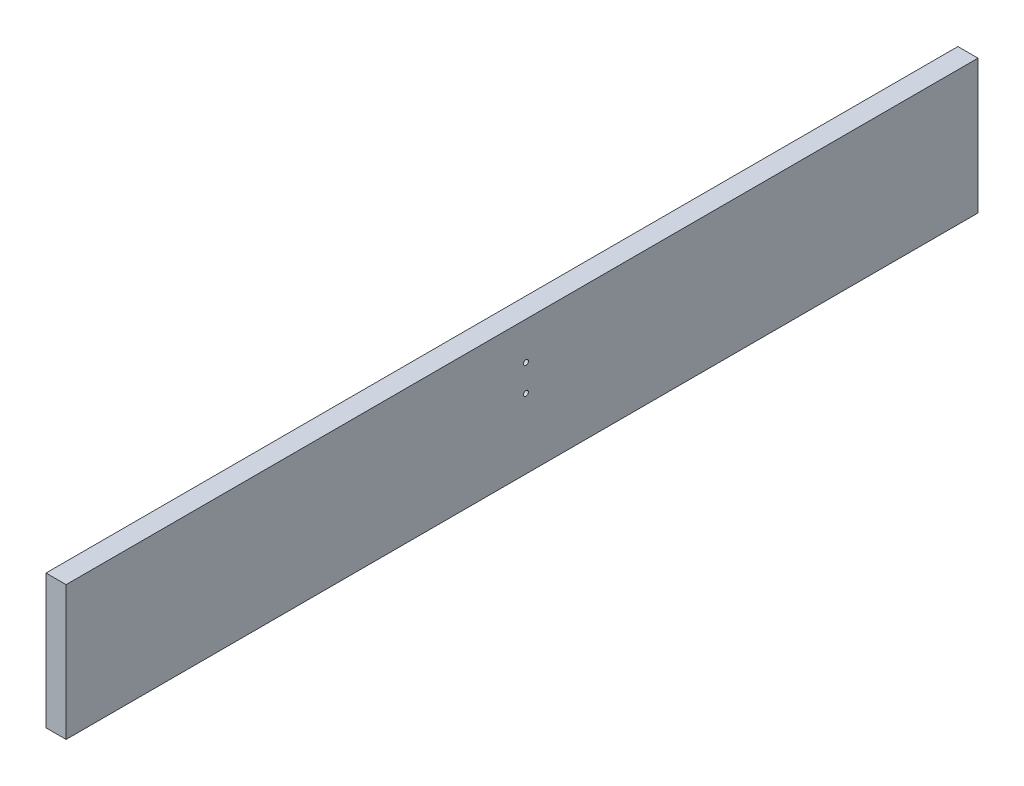
ISO-10303-21;
HEADER;
FILE_DESCRIPTION(('STEP AP214'),'2;1');
FILE_NAME('part.step','',(''),(''),'','','');
FILE_SCHEMA(('AUTOMOTIVE_DESIGN { 1 0 10303 214 1 1 1 1 }'));
ENDSEC;
DATA;
#1=APPLICATION_CONTEXT('core data for automotive mechanical design processes');
#2=APPLICATION_PROTOCOL_DEFINITION('international standard','automotive_design',2000,#1);
#3=PRODUCT_CONTEXT('',#1,'mechanical');
#4=PRODUCT('Part','Part','',(#3));
#5=PRODUCT_RELATED_PRODUCT_CATEGORY('part','',(#4));
#6=PRODUCT_DEFINITION_FORMATION('','',#4);
#7=PRODUCT_DEFINITION_CONTEXT('part definition',#1,'design');
#8=PRODUCT_DEFINITION('design','',#6,#7);
#9=PRODUCT_DEFINITION_SHAPE('','',#8);
#10=(LENGTH_UNIT() NAMED_UNIT(*) SI_UNIT(.MILLI.,.METRE.));
#11=(NAMED_UNIT(*) PLANE_ANGLE_UNIT() SI_UNIT($,.RADIAN.));
#12=(NAMED_UNIT(*) SI_UNIT($,.STERADIAN.) SOLID_ANGLE_UNIT());
#13=UNCERTAINTY_MEASURE_WITH_UNIT(LENGTH_MEASURE(1.E-05),#10,'distance_accuracy_value','');
#14=(GEOMETRIC_REPRESENTATION_CONTEXT(3) GLOBAL_UNCERTAINTY_ASSIGNED_CONTEXT((#13)) GLOBAL_UNIT_ASSIGNED_CONTEXT((#10,
#11,#12)) REPRESENTATION_CONTEXT('',''));
#15=CARTESIAN_POINT('',(0.,0.,0.));
#16=DIRECTION('',(0.,0.,1.));
#17=DIRECTION('',(1.,0.,0.));
#18=AXIS2_PLACEMENT_3D('',#15,#16,#17);
#19=CARTESIAN_POINT('',(9.52499999999999,63.5,863.6));
#20=DIRECTION('',(-1.,0.,0.));
#21=DIRECTION('',(0.,-1.,0.));
#22=AXIS2_PLACEMENT_3D('',#19,#20,#21);
#23=PLANE('',#22);
#24=CARTESIAN_POINT('',(9.52500000000001,27.94,428.139617684));
#25=DIRECTION('',(-1.,0.,0.));
#26=DIRECTION('',(0.,-1.,0.));
#27=AXIS2_PLACEMENT_3D('',#24,#25,#26);
#28=CIRCLE('',#27,2.38125000000001);
#29=CARTESIAN_POINT('',(9.52500000000001,25.55875,428.139617684));
#30=VERTEX_POINT('',#29);
#31=EDGE_CURVE('E114',#30,#30,#28,.T.);
#32=ORIENTED_EDGE('',*,*,#31,.T.);
#33=EDGE_LOOP('',(#32));
#34=FACE_BOUND('',#33,.T.);
#35=CARTESIAN_POINT('',(9.52500000000001,2.53999999999998,428.139617684));
#36=DIRECTION('',(-1.,0.,0.));
#37=DIRECTION('',(0.,-1.,0.));
#38=AXIS2_PLACEMENT_3D('',#35,#36,#37);
#39=CIRCLE('',#38,2.38125000000001);
#40=CARTESIAN_POINT('',(9.52500000000001,0.158749999999975,428.139617684));
#41=VERTEX_POINT('',#40);
#42=EDGE_CURVE('E100',#41,#41,#39,.T.);
#43=ORIENTED_EDGE('',*,*,#42,.T.);
#44=EDGE_LOOP('',(#43));
#45=FACE_BOUND('',#44,.T.);
#46=DIRECTION('',(0.,1.,0.));
#47=VECTOR('',#46,1.);
#48=CARTESIAN_POINT('',(9.52499999999999,63.5,0.));
#49=LINE('',#48,#47);
#50=CARTESIAN_POINT('',(9.52500000000001,-63.5,0.));
#51=VERTEX_POINT('',#50);
#52=CARTESIAN_POINT('',(9.52499999999999,63.5,0.));
#53=VERTEX_POINT('',#52);
#54=EDGE_CURVE('E97',#51,#53,#49,.T.);
#55=ORIENTED_EDGE('',*,*,#54,.T.);
#56=DIRECTION('',(0.,0.,-1.));
#57=VECTOR('',#56,1.);
#58=CARTESIAN_POINT('',(9.52499999999999,63.5,863.6));
#59=LINE('',#58,#57);
#60=CARTESIAN_POINT('',(9.52499999999999,63.5,863.6));
#61=VERTEX_POINT('',#60);
#62=EDGE_CURVE('E11',#61,#53,#59,.T.);
#63=ORIENTED_EDGE('',*,*,#62,.F.);
#64=DIRECTION('',(0.,1.,0.));
#65=VECTOR('',#64,1.);
#66=CARTESIAN_POINT('',(9.52499999999999,63.5,863.6));
#67=LINE('',#66,#65);
#68=CARTESIAN_POINT('',(9.52500000000001,-63.5,863.6));
#69=VERTEX_POINT('',#68);
#70=EDGE_CURVE('E85',#69,#61,#67,.T.);
#71=ORIENTED_EDGE('',*,*,#70,.F.);
#72=DIRECTION('',(0.,0.,-1.));
#73=VECTOR('',#72,1.);
#74=CARTESIAN_POINT('',(9.52500000000001,-63.5,863.6));
#75=LINE('',#74,#73);
#76=EDGE_CURVE('E93',#69,#51,#75,.T.);
#77=ORIENTED_EDGE('',*,*,#76,.T.);
#78=EDGE_LOOP('',(#55,#63,#71,#77));
#79=FACE_BOUND('',#78,.T.);
#80=ADVANCED_FACE('F34',(#34,#45,#79),#23,.F.);
#81=CARTESIAN_POINT('',(-9.52500000000001,63.5,863.6));
#82=DIRECTION('',(0.,-1.,0.));
#83=DIRECTION('',(0.,0.,-1.));
#84=AXIS2_PLACEMENT_3D('',#81,#82,#83);
#85=PLANE('',#84);
#86=DIRECTION('',(-1.,0.,0.));
#87=VECTOR('',#86,1.);
#88=CARTESIAN_POINT('',(-9.52500000000001,63.5,0.));
#89=LINE('',#88,#87);
#90=CARTESIAN_POINT('',(-9.52500000000001,63.5,0.));
#91=VERTEX_POINT('',#90);
#92=EDGE_CURVE('E89',#53,#91,#89,.T.);
#93=ORIENTED_EDGE('',*,*,#92,.T.);
#94=DIRECTION('',(0.,0.,-1.));
#95=VECTOR('',#94,1.);
#96=CARTESIAN_POINT('',(-9.52500000000001,63.5,863.6));
#97=LINE('',#96,#95);
#98=CARTESIAN_POINT('',(-9.52500000000001,63.5,863.6));
#99=VERTEX_POINT('',#98);
#100=EDGE_CURVE('E42',#99,#91,#97,.T.);
#101=ORIENTED_EDGE('',*,*,#100,.F.);
#102=DIRECTION('',(-1.,0.,0.));
#103=VECTOR('',#102,1.);
#104=CARTESIAN_POINT('',(-9.52500000000001,63.5,863.6));
#105=LINE('',#104,#103);
#106=EDGE_CURVE('E80',#61,#99,#105,.T.);
#107=ORIENTED_EDGE('',*,*,#106,.F.);
#108=ORIENTED_EDGE('',*,*,#62,.T.);
#109=EDGE_LOOP('',(#93,#101,#107,#108));
#110=FACE_BOUND('',#109,.T.);
#111=ADVANCED_FACE('F88',(#110),#85,.F.);
#112=CARTESIAN_POINT('',(-9.52500000000001,63.5,863.6));
#113=DIRECTION('',(1.,0.,0.));
#114=DIRECTION('',(0.,1.,0.));
#115=AXIS2_PLACEMENT_3D('',#112,#113,#114);
#116=PLANE('',#115);
#117=CARTESIAN_POINT('',(-9.52500000000001,27.94,428.139617684));
#118=DIRECTION('',(-1.,0.,0.));
#119=DIRECTION('',(0.,-1.,0.));
#120=AXIS2_PLACEMENT_3D('',#117,#118,#119);
#121=CIRCLE('',#120,2.38125000000001);
#122=CARTESIAN_POINT('',(-9.52500000000001,25.55875,428.139617684));
#123=VERTEX_POINT('',#122);
#124=EDGE_CURVE('E117',#123,#123,#121,.T.);
#125=ORIENTED_EDGE('',*,*,#124,.F.);
#126=EDGE_LOOP('',(#125));
#127=FACE_BOUND('',#126,.T.);
#128=CARTESIAN_POINT('',(-9.525,2.53999999999998,428.139617684));
#129=DIRECTION('',(-1.,0.,0.));
#130=DIRECTION('',(0.,-1.,0.));
#131=AXIS2_PLACEMENT_3D('',#128,#129,#130);
#132=CIRCLE('',#131,2.38125000000001);
#133=CARTESIAN_POINT('',(-9.525,0.158749999999973,428.139617684));
#134=VERTEX_POINT('',#133);
#135=EDGE_CURVE('E111',#134,#134,#132,.T.);
#136=ORIENTED_EDGE('',*,*,#135,.F.);
#137=EDGE_LOOP('',(#136));
#138=FACE_BOUND('',#137,.T.);
#139=DIRECTION('',(0.,-1.,0.));
#140=VECTOR('',#139,1.);
#141=CARTESIAN_POINT('',(-9.52500000000001,63.5,0.));
#142=LINE('',#141,#140);
#143=CARTESIAN_POINT('',(-9.525,-63.5,0.));
#144=VERTEX_POINT('',#143);
#145=EDGE_CURVE('E67',#91,#144,#142,.T.);
#146=ORIENTED_EDGE('',*,*,#145,.T.);
#147=DIRECTION('',(0.,0.,-1.));
#148=VECTOR('',#147,1.);
#149=CARTESIAN_POINT('',(-9.525,-63.5,863.6));
#150=LINE('',#149,#148);
#151=CARTESIAN_POINT('',(-9.525,-63.5,863.6));
#152=VERTEX_POINT('',#151);
#153=EDGE_CURVE('E90',#152,#144,#150,.T.);
#154=ORIENTED_EDGE('',*,*,#153,.F.);
#155=DIRECTION('',(0.,-1.,0.));
#156=VECTOR('',#155,1.);
#157=CARTESIAN_POINT('',(-9.52500000000001,63.5,863.6));
#158=LINE('',#157,#156);
#159=EDGE_CURVE('E83',#99,#152,#158,.T.);
#160=ORIENTED_EDGE('',*,*,#159,.F.);
#161=ORIENTED_EDGE('',*,*,#100,.T.);
#162=EDGE_LOOP('',(#146,#154,#160,#161));
#163=FACE_BOUND('',#162,.T.);
#164=ADVANCED_FACE('F91',(#127,#138,#163),#116,.F.);
#165=CARTESIAN_POINT('',(-9.525,-63.5,863.6));
#166=DIRECTION('',(0.,1.,0.));
#167=DIRECTION('',(0.,0.,1.));
#168=AXIS2_PLACEMENT_3D('',#165,#166,#167);
#169=PLANE('',#168);
#170=DIRECTION('',(1.,0.,0.));
#171=VECTOR('',#170,1.);
#172=CARTESIAN_POINT('',(-9.525,-63.5,0.));
#173=LINE('',#172,#171);
#174=EDGE_CURVE('E73',#144,#51,#173,.T.);
#175=ORIENTED_EDGE('',*,*,#174,.T.);
#176=ORIENTED_EDGE('',*,*,#76,.F.);
#177=DIRECTION('',(1.,0.,0.));
#178=VECTOR('',#177,1.);
#179=CARTESIAN_POINT('',(-9.525,-63.5,863.6));
#180=LINE('',#179,#178);
#181=EDGE_CURVE('E50',#152,#69,#180,.T.);
#182=ORIENTED_EDGE('',*,*,#181,.F.);
#183=ORIENTED_EDGE('',*,*,#153,.T.);
#184=EDGE_LOOP('',(#175,#176,#182,#183));
#185=FACE_BOUND('',#184,.T.);
#186=ADVANCED_FACE('F105',(#185),#169,.F.);
#187=CARTESIAN_POINT('',(0.,0.,863.6));
#188=DIRECTION('',(0.,0.,1.));
#189=DIRECTION('',(1.,0.,0.));
#190=AXIS2_PLACEMENT_3D('',#187,#188,#189);
#191=PLANE('',#190);
#192=ORIENTED_EDGE('',*,*,#70,.T.);
#193=ORIENTED_EDGE('',*,*,#106,.T.);
#194=ORIENTED_EDGE('',*,*,#159,.T.);
#195=ORIENTED_EDGE('',*,*,#181,.T.);
#196=EDGE_LOOP('',(#192,#193,#194,#195));
#197=FACE_BOUND('',#196,.T.);
#198=ADVANCED_FACE('F81',(#197),#191,.T.);
#199=CARTESIAN_POINT('',(0.,0.,0.));
#200=DIRECTION('',(0.,0.,1.));
#201=DIRECTION('',(1.,0.,0.));
#202=AXIS2_PLACEMENT_3D('',#199,#200,#201);
#203=PLANE('',#202);
#204=ORIENTED_EDGE('',*,*,#54,.F.);
#205=ORIENTED_EDGE('',*,*,#174,.F.);
#206=ORIENTED_EDGE('',*,*,#145,.F.);
#207=ORIENTED_EDGE('',*,*,#92,.F.);
#208=EDGE_LOOP('',(#204,#205,#206,#207));
#209=FACE_BOUND('',#208,.T.);
#210=ADVANCED_FACE('F108',(#209),#203,.F.);
#211=CARTESIAN_POINT('',(9.52500000000001,2.53999999999998,428.139617684));
#212=DIRECTION('',(-1.,0.,0.));
#213=DIRECTION('',(0.,-1.,0.));
#214=AXIS2_PLACEMENT_3D('',#211,#212,#213);
#215=CYLINDRICAL_SURFACE('',#214,2.38125000000001);
#216=ORIENTED_EDGE('',*,*,#42,.F.);
#217=EDGE_LOOP('',(#216));
#218=FACE_BOUND('',#217,.T.);
#219=ORIENTED_EDGE('',*,*,#135,.T.);
#220=EDGE_LOOP('',(#219));
#221=FACE_BOUND('',#220,.T.);
#222=ADVANCED_FACE('F128',(#218,#221),#215,.F.);
#223=CARTESIAN_POINT('',(9.52500000000001,27.94,428.139617684));
#224=DIRECTION('',(-1.,0.,0.));
#225=DIRECTION('',(0.,-1.,0.));
#226=AXIS2_PLACEMENT_3D('',#223,#224,#225);
#227=CYLINDRICAL_SURFACE('',#226,2.38125000000001);
#228=ORIENTED_EDGE('',*,*,#31,.F.);
#229=EDGE_LOOP('',(#228));
#230=FACE_BOUND('',#229,.T.);
#231=ORIENTED_EDGE('',*,*,#124,.T.);
#232=EDGE_LOOP('',(#231));
#233=FACE_BOUND('',#232,.T.);
#234=ADVANCED_FACE('F125',(#230,#233),#227,.F.);
#235=CLOSED_SHELL('',(#80,#111,#164,#186,#198,#210,#222,#234));
#236=MANIFOLD_SOLID_BREP('B2',#235);
#237=ADVANCED_BREP_SHAPE_REPRESENTATION('',(#18,#236),#14);
#238=SHAPE_DEFINITION_REPRESENTATION(#9,#237);
ENDSEC;
END-ISO-10303-21;
